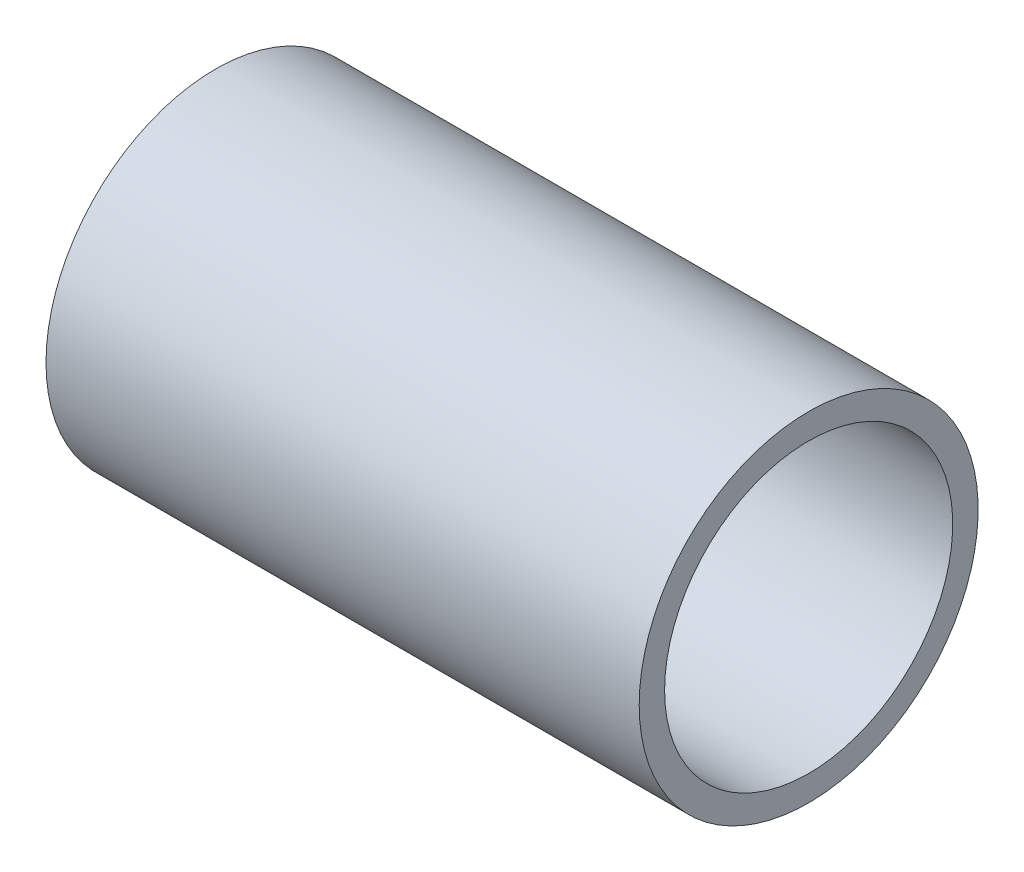
ISO-10303-21;
HEADER;
FILE_DESCRIPTION(('STEP AP214'),'2;1');
FILE_NAME('part.step','',(''),(''),'','','');
FILE_SCHEMA(('AUTOMOTIVE_DESIGN { 1 0 10303 214 1 1 1 1 }'));
ENDSEC;
DATA;
#1=APPLICATION_CONTEXT('core data for automotive mechanical design processes');
#2=APPLICATION_PROTOCOL_DEFINITION('international standard','automotive_design',2000,#1);
#3=PRODUCT_CONTEXT('',#1,'mechanical');
#4=PRODUCT('Part','Part','',(#3));
#5=PRODUCT_RELATED_PRODUCT_CATEGORY('part','',(#4));
#6=PRODUCT_DEFINITION_FORMATION('','',#4);
#7=PRODUCT_DEFINITION_CONTEXT('part definition',#1,'design');
#8=PRODUCT_DEFINITION('design','',#6,#7);
#9=PRODUCT_DEFINITION_SHAPE('','',#8);
#10=(LENGTH_UNIT() NAMED_UNIT(*) SI_UNIT(.MILLI.,.METRE.));
#11=(NAMED_UNIT(*) PLANE_ANGLE_UNIT() SI_UNIT($,.RADIAN.));
#12=(NAMED_UNIT(*) SI_UNIT($,.STERADIAN.) SOLID_ANGLE_UNIT());
#13=UNCERTAINTY_MEASURE_WITH_UNIT(LENGTH_MEASURE(1.E-05),#10,'distance_accuracy_value','');
#14=(GEOMETRIC_REPRESENTATION_CONTEXT(3) GLOBAL_UNCERTAINTY_ASSIGNED_CONTEXT((#13)) GLOBAL_UNIT_ASSIGNED_CONTEXT((#10,
#11,#12)) REPRESENTATION_CONTEXT('',''));
#15=CARTESIAN_POINT('',(0.,0.,0.));
#16=DIRECTION('',(0.,0.,1.));
#17=DIRECTION('',(1.,0.,0.));
#18=AXIS2_PLACEMENT_3D('',#15,#16,#17);
#19=CARTESIAN_POINT('',(-117.11518633708,0.,0.));
#20=DIRECTION('',(-1.,0.,0.));
#21=DIRECTION('',(0.,0.,1.));
#22=AXIS2_PLACEMENT_3D('',#19,#20,#21);
#23=CYLINDRICAL_SURFACE('',#22,19.9999999999999);
#24=CARTESIAN_POINT('',(268.295772415471,0.,0.));
#25=DIRECTION('',(-1.,0.,0.));
#26=DIRECTION('',(0.,0.,1.));
#27=AXIS2_PLACEMENT_3D('',#24,#25,#26);
#28=CIRCLE('',#27,19.9999999999999);
#29=CARTESIAN_POINT('',(268.295772415471,0.,19.9999999999999));
#30=VERTEX_POINT('',#29);
#31=EDGE_CURVE('E62',#30,#30,#28,.T.);
#32=ORIENTED_EDGE('',*,*,#31,.F.);
#33=EDGE_LOOP('',(#32));
#34=FACE_BOUND('',#33,.T.);
#35=CARTESIAN_POINT('',(338.295772415471,0.,0.));
#36=DIRECTION('',(-1.,0.,0.));
#37=DIRECTION('',(0.,0.,1.));
#38=AXIS2_PLACEMENT_3D('',#35,#36,#37);
#39=CIRCLE('',#38,20.);
#40=CARTESIAN_POINT('',(338.295772415471,0.,20.));
#41=VERTEX_POINT('',#40);
#42=EDGE_CURVE('E10',#41,#41,#39,.T.);
#43=ORIENTED_EDGE('',*,*,#42,.T.);
#44=EDGE_LOOP('',(#43));
#45=FACE_BOUND('',#44,.T.);
#46=ADVANCED_FACE('F33',(#34,#45),#23,.T.);
#47=CARTESIAN_POINT('',(338.295772415471,20.,0.));
#48=DIRECTION('',(-1.,0.,0.));
#49=DIRECTION('',(0.,0.,1.));
#50=AXIS2_PLACEMENT_3D('',#47,#48,#49);
#51=PLANE('',#50);
#52=ORIENTED_EDGE('',*,*,#42,.F.);
#53=EDGE_LOOP('',(#52));
#54=FACE_BOUND('',#53,.T.);
#55=CARTESIAN_POINT('',(338.295772415471,0.,0.));
#56=DIRECTION('',(-1.,0.,0.));
#57=DIRECTION('',(0.,0.,1.));
#58=AXIS2_PLACEMENT_3D('',#55,#56,#57);
#59=CIRCLE('',#58,17.);
#60=CARTESIAN_POINT('',(338.295772415471,0.,17.0000000000001));
#61=VERTEX_POINT('',#60);
#62=EDGE_CURVE('E40',#61,#61,#59,.T.);
#63=ORIENTED_EDGE('',*,*,#62,.T.);
#64=EDGE_LOOP('',(#63));
#65=FACE_BOUND('',#64,.T.);
#66=ADVANCED_FACE('F71',(#54,#65),#51,.F.);
#67=CARTESIAN_POINT('',(-117.11518633708,0.,0.));
#68=DIRECTION('',(-1.,0.,0.));
#69=DIRECTION('',(0.,0.,1.));
#70=AXIS2_PLACEMENT_3D('',#67,#68,#69);
#71=CYLINDRICAL_SURFACE('',#70,17.);
#72=ORIENTED_EDGE('',*,*,#62,.F.);
#73=EDGE_LOOP('',(#72));
#74=FACE_BOUND('',#73,.T.);
#75=CARTESIAN_POINT('',(313.295772415471,0.,0.));
#76=DIRECTION('',(-1.,0.,0.));
#77=DIRECTION('',(0.,0.,1.));
#78=AXIS2_PLACEMENT_3D('',#75,#76,#77);
#79=CIRCLE('',#78,17.);
#80=CARTESIAN_POINT('',(313.295772415471,0.,17.0000000000001));
#81=VERTEX_POINT('',#80);
#82=EDGE_CURVE('E46',#81,#81,#79,.T.);
#83=ORIENTED_EDGE('',*,*,#82,.T.);
#84=EDGE_LOOP('',(#83));
#85=FACE_BOUND('',#84,.T.);
#86=ADVANCED_FACE('F75',(#74,#85),#71,.F.);
#87=CARTESIAN_POINT('',(313.295772415471,17.,0.));
#88=DIRECTION('',(-1.,0.,0.));
#89=DIRECTION('',(0.,0.,1.));
#90=AXIS2_PLACEMENT_3D('',#87,#88,#89);
#91=PLANE('',#90);
#92=ORIENTED_EDGE('',*,*,#82,.F.);
#93=EDGE_LOOP('',(#92));
#94=FACE_BOUND('',#93,.T.);
#95=CARTESIAN_POINT('',(313.295772415471,0.,0.));
#96=DIRECTION('',(-1.,0.,0.));
#97=DIRECTION('',(0.,0.,1.));
#98=AXIS2_PLACEMENT_3D('',#95,#96,#97);
#99=CIRCLE('',#98,14.5);
#100=CARTESIAN_POINT('',(313.295772415471,0.,14.5000000000001));
#101=VERTEX_POINT('',#100);
#102=EDGE_CURVE('E52',#101,#101,#99,.T.);
#103=ORIENTED_EDGE('',*,*,#102,.T.);
#104=EDGE_LOOP('',(#103));
#105=FACE_BOUND('',#104,.T.);
#106=ADVANCED_FACE('F80',(#94,#105),#91,.F.);
#107=CARTESIAN_POINT('',(-117.11518633708,0.,0.));
#108=DIRECTION('',(-1.,0.,0.));
#109=DIRECTION('',(0.,0.,1.));
#110=AXIS2_PLACEMENT_3D('',#107,#108,#109);
#111=CYLINDRICAL_SURFACE('',#110,14.5);
#112=ORIENTED_EDGE('',*,*,#102,.F.);
#113=EDGE_LOOP('',(#112));
#114=FACE_BOUND('',#113,.T.);
#115=CARTESIAN_POINT('',(268.544722908317,0.,0.));
#116=DIRECTION('',(-1.,0.,0.));
#117=DIRECTION('',(0.,0.,1.));
#118=AXIS2_PLACEMENT_3D('',#115,#116,#117);
#119=CIRCLE('',#118,14.5);
#120=CARTESIAN_POINT('',(268.544722908317,0.,14.5000000000001));
#121=VERTEX_POINT('',#120);
#122=EDGE_CURVE('E58',#121,#121,#119,.T.);
#123=ORIENTED_EDGE('',*,*,#122,.T.);
#124=EDGE_LOOP('',(#123));
#125=FACE_BOUND('',#124,.T.);
#126=ADVANCED_FACE('F86',(#114,#125),#111,.F.);
#127=CARTESIAN_POINT('',(-107.684602878563,0.,0.));
#128=DIRECTION('',(-1.,0.,0.));
#129=DIRECTION('',(0.,0.,1.));
#130=AXIS2_PLACEMENT_3D('',#127,#128,#129);
#131=DEGENERATE_TOROIDAL_SURFACE('',#130,0.226093108418368,376.5,.T.);
#132=ORIENTED_EDGE('',*,*,#122,.F.);
#133=EDGE_LOOP('',(#132));
#134=FACE_BOUND('',#133,.T.);
#135=ORIENTED_EDGE('',*,*,#31,.T.);
#136=EDGE_LOOP('',(#135));
#137=FACE_BOUND('',#136,.T.);
#138=ADVANCED_FACE('F68',(#134,#137),#131,.F.);
#139=CLOSED_SHELL('',(#46,#66,#86,#106,#126,#138));
#140=MANIFOLD_SOLID_BREP('B2',#139);
#141=ADVANCED_BREP_SHAPE_REPRESENTATION('',(#18,#140),#14);
#142=SHAPE_DEFINITION_REPRESENTATION(#9,#141);
ENDSEC;
END-ISO-10303-21;
